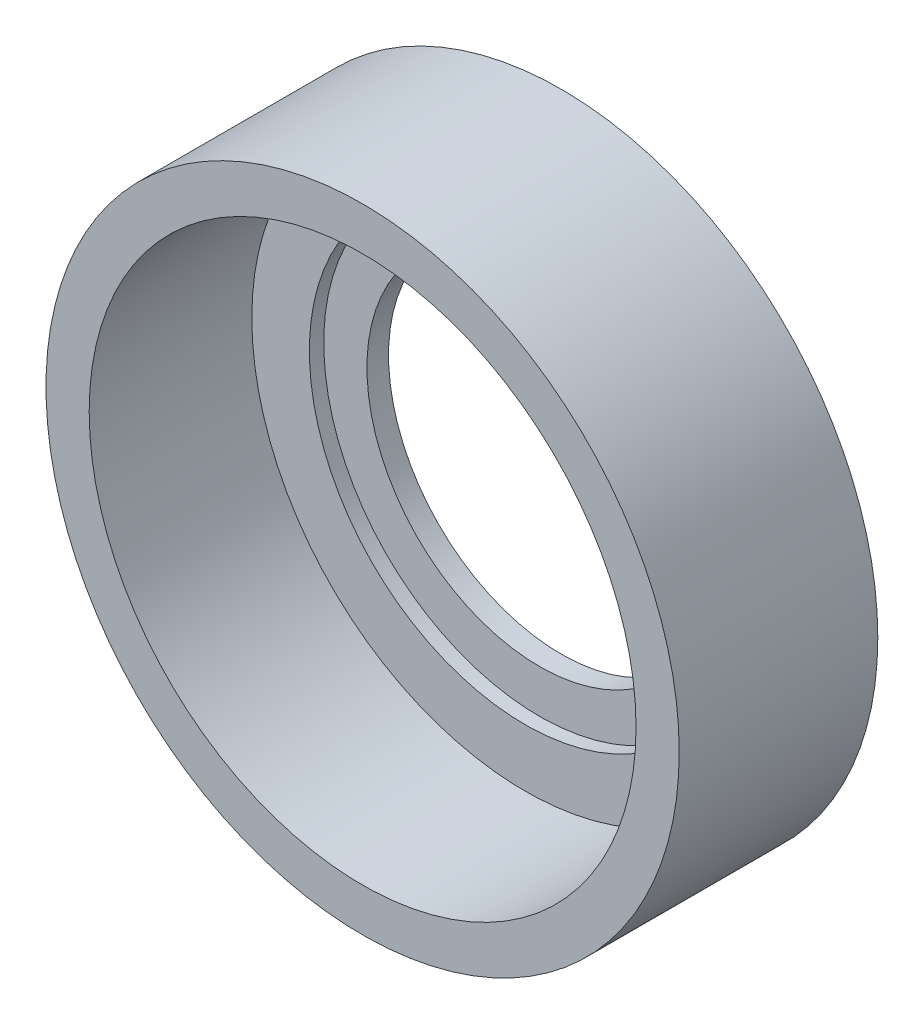
ISO-10303-21;
HEADER;
FILE_DESCRIPTION(('STEP AP214'),'2;1');
FILE_NAME('part.step','',(''),(''),'','','');
FILE_SCHEMA(('AUTOMOTIVE_DESIGN { 1 0 10303 214 1 1 1 1 }'));
ENDSEC;
DATA;
#1=APPLICATION_CONTEXT('core data for automotive mechanical design processes');
#2=APPLICATION_PROTOCOL_DEFINITION('international standard','automotive_design',2000,#1);
#3=PRODUCT_CONTEXT('',#1,'mechanical');
#4=PRODUCT('Part','Part','',(#3));
#5=PRODUCT_RELATED_PRODUCT_CATEGORY('part','',(#4));
#6=PRODUCT_DEFINITION_FORMATION('','',#4);
#7=PRODUCT_DEFINITION_CONTEXT('part definition',#1,'design');
#8=PRODUCT_DEFINITION('design','',#6,#7);
#9=PRODUCT_DEFINITION_SHAPE('','',#8);
#10=(LENGTH_UNIT() NAMED_UNIT(*) SI_UNIT(.MILLI.,.METRE.));
#11=(NAMED_UNIT(*) PLANE_ANGLE_UNIT() SI_UNIT($,.RADIAN.));
#12=(NAMED_UNIT(*) SI_UNIT($,.STERADIAN.) SOLID_ANGLE_UNIT());
#13=UNCERTAINTY_MEASURE_WITH_UNIT(LENGTH_MEASURE(1.E-05),#10,'distance_accuracy_value','');
#14=(GEOMETRIC_REPRESENTATION_CONTEXT(3) GLOBAL_UNCERTAINTY_ASSIGNED_CONTEXT((#13)) GLOBAL_UNIT_ASSIGNED_CONTEXT((#10,
#11,#12)) REPRESENTATION_CONTEXT('',''));
#15=CARTESIAN_POINT('',(0.,0.,0.));
#16=DIRECTION('',(0.,0.,1.));
#17=DIRECTION('',(1.,0.,0.));
#18=AXIS2_PLACEMENT_3D('',#15,#16,#17);
#19=CARTESIAN_POINT('',(0.,0.,1.25));
#20=DIRECTION('',(0.,0.,1.));
#21=DIRECTION('',(1.,0.,0.));
#22=AXIS2_PLACEMENT_3D('',#19,#20,#21);
#23=PLANE('',#22);
#24=CARTESIAN_POINT('',(0.,0.,1.25));
#25=DIRECTION('',(0.,0.,1.));
#26=DIRECTION('',(1.,0.,0.));
#27=AXIS2_PLACEMENT_3D('',#24,#25,#26);
#28=CIRCLE('',#27,7.5);
#29=CARTESIAN_POINT('',(7.5,0.,1.25));
#30=VERTEX_POINT('',#29);
#31=EDGE_CURVE('E62',#30,#30,#28,.T.);
#32=ORIENTED_EDGE('',*,*,#31,.F.);
#33=EDGE_LOOP('',(#32));
#34=FACE_BOUND('',#33,.T.);
#35=CARTESIAN_POINT('',(0.,0.,1.25));
#36=DIRECTION('',(0.,0.,1.));
#37=DIRECTION('',(1.,0.,0.));
#38=AXIS2_PLACEMENT_3D('',#35,#36,#37);
#39=CIRCLE('',#38,9.5);
#40=CARTESIAN_POINT('',(9.5,0.,1.25));
#41=VERTEX_POINT('',#40);
#42=EDGE_CURVE('E76',#41,#41,#39,.T.);
#43=ORIENTED_EDGE('',*,*,#42,.T.);
#44=EDGE_LOOP('',(#43));
#45=FACE_BOUND('',#44,.T.);
#46=ADVANCED_FACE('F43',(#34,#45),#23,.T.);
#47=CARTESIAN_POINT('',(0.,0.,0.75));
#48=DIRECTION('',(0.,0.,1.));
#49=DIRECTION('',(1.,0.,0.));
#50=AXIS2_PLACEMENT_3D('',#47,#48,#49);
#51=PLANE('',#50);
#52=CARTESIAN_POINT('',(0.,0.,0.75));
#53=DIRECTION('',(0.,0.,1.));
#54=DIRECTION('',(1.,0.,0.));
#55=AXIS2_PLACEMENT_3D('',#52,#53,#54);
#56=CIRCLE('',#55,6.);
#57=CARTESIAN_POINT('',(6.,0.,0.75));
#58=VERTEX_POINT('',#57);
#59=EDGE_CURVE('E51',#58,#58,#56,.T.);
#60=ORIENTED_EDGE('',*,*,#59,.F.);
#61=EDGE_LOOP('',(#60));
#62=FACE_BOUND('',#61,.T.);
#63=CARTESIAN_POINT('',(0.,0.,0.75));
#64=DIRECTION('',(0.,0.,1.));
#65=DIRECTION('',(1.,0.,0.));
#66=AXIS2_PLACEMENT_3D('',#63,#64,#65);
#67=CIRCLE('',#66,7.5);
#68=CARTESIAN_POINT('',(7.5,0.,0.75));
#69=VERTEX_POINT('',#68);
#70=EDGE_CURVE('E64',#69,#69,#67,.T.);
#71=ORIENTED_EDGE('',*,*,#70,.T.);
#72=EDGE_LOOP('',(#71));
#73=FACE_BOUND('',#72,.T.);
#74=ADVANCED_FACE('F102',(#62,#73),#51,.T.);
#75=CARTESIAN_POINT('',(0.,0.,0.));
#76=DIRECTION('',(0.,0.,1.));
#77=DIRECTION('',(1.,0.,0.));
#78=AXIS2_PLACEMENT_3D('',#75,#76,#77);
#79=PLANE('',#78);
#80=CARTESIAN_POINT('',(0.,0.,0.));
#81=DIRECTION('',(0.,0.,1.));
#82=DIRECTION('',(1.,0.,0.));
#83=AXIS2_PLACEMENT_3D('',#80,#81,#82);
#84=CIRCLE('',#83,11.);
#85=CARTESIAN_POINT('',(11.,0.,0.));
#86=VERTEX_POINT('',#85);
#87=EDGE_CURVE('E10',#86,#86,#84,.T.);
#88=ORIENTED_EDGE('',*,*,#87,.F.);
#89=EDGE_LOOP('',(#88));
#90=FACE_BOUND('',#89,.T.);
#91=CARTESIAN_POINT('',(0.,0.,0.));
#92=DIRECTION('',(0.,0.,1.));
#93=DIRECTION('',(1.,0.,0.));
#94=AXIS2_PLACEMENT_3D('',#91,#92,#93);
#95=CIRCLE('',#94,6.);
#96=CARTESIAN_POINT('',(6.,0.,0.));
#97=VERTEX_POINT('',#96);
#98=EDGE_CURVE('E56',#97,#97,#95,.T.);
#99=ORIENTED_EDGE('',*,*,#98,.T.);
#100=EDGE_LOOP('',(#99));
#101=FACE_BOUND('',#100,.T.);
#102=ADVANCED_FACE('F108',(#90,#101),#79,.F.);
#103=CARTESIAN_POINT('',(0.,0.,0.75));
#104=DIRECTION('',(0.,0.,-1.));
#105=DIRECTION('',(-1.,0.,0.));
#106=AXIS2_PLACEMENT_3D('',#103,#104,#105);
#107=CYLINDRICAL_SURFACE('',#106,11.);
#108=ORIENTED_EDGE('',*,*,#87,.T.);
#109=EDGE_LOOP('',(#108));
#110=FACE_BOUND('',#109,.T.);
#111=CARTESIAN_POINT('',(0.,0.,6.9));
#112=DIRECTION('',(0.,0.,1.));
#113=DIRECTION('',(1.,0.,0.));
#114=AXIS2_PLACEMENT_3D('',#111,#112,#113);
#115=CIRCLE('',#114,11.);
#116=CARTESIAN_POINT('',(11.,0.,6.9));
#117=VERTEX_POINT('',#116);
#118=EDGE_CURVE('E68',#117,#117,#115,.T.);
#119=ORIENTED_EDGE('',*,*,#118,.F.);
#120=EDGE_LOOP('',(#119));
#121=FACE_BOUND('',#120,.T.);
#122=ADVANCED_FACE('F45',(#110,#121),#107,.T.);
#123=CARTESIAN_POINT('',(0.,0.,0.75));
#124=DIRECTION('',(0.,0.,-1.));
#125=DIRECTION('',(-1.,0.,0.));
#126=AXIS2_PLACEMENT_3D('',#123,#124,#125);
#127=CYLINDRICAL_SURFACE('',#126,6.);
#128=ORIENTED_EDGE('',*,*,#59,.T.);
#129=EDGE_LOOP('',(#128));
#130=FACE_BOUND('',#129,.T.);
#131=ORIENTED_EDGE('',*,*,#98,.F.);
#132=EDGE_LOOP('',(#131));
#133=FACE_BOUND('',#132,.T.);
#134=ADVANCED_FACE('F98',(#130,#133),#127,.F.);
#135=CARTESIAN_POINT('',(0.,0.,1.25));
#136=DIRECTION('',(0.,0.,-1.));
#137=DIRECTION('',(-1.,0.,0.));
#138=AXIS2_PLACEMENT_3D('',#135,#136,#137);
#139=CYLINDRICAL_SURFACE('',#138,7.5);
#140=ORIENTED_EDGE('',*,*,#31,.T.);
#141=EDGE_LOOP('',(#140));
#142=FACE_BOUND('',#141,.T.);
#143=ORIENTED_EDGE('',*,*,#70,.F.);
#144=EDGE_LOOP('',(#143));
#145=FACE_BOUND('',#144,.T.);
#146=ADVANCED_FACE('F89',(#142,#145),#139,.F.);
#147=CARTESIAN_POINT('',(0.,0.,6.9));
#148=DIRECTION('',(0.,0.,1.));
#149=DIRECTION('',(1.,0.,0.));
#150=AXIS2_PLACEMENT_3D('',#147,#148,#149);
#151=PLANE('',#150);
#152=ORIENTED_EDGE('',*,*,#118,.T.);
#153=EDGE_LOOP('',(#152));
#154=FACE_BOUND('',#153,.T.);
#155=CARTESIAN_POINT('',(0.,0.,6.9));
#156=DIRECTION('',(0.,0.,1.));
#157=DIRECTION('',(1.,0.,0.));
#158=AXIS2_PLACEMENT_3D('',#155,#156,#157);
#159=CIRCLE('',#158,9.5);
#160=CARTESIAN_POINT('',(9.5,0.,6.9));
#161=VERTEX_POINT('',#160);
#162=EDGE_CURVE('E75',#161,#161,#159,.T.);
#163=ORIENTED_EDGE('',*,*,#162,.F.);
#164=EDGE_LOOP('',(#163));
#165=FACE_BOUND('',#164,.T.);
#166=ADVANCED_FACE('F87',(#154,#165),#151,.T.);
#167=CARTESIAN_POINT('',(0.,0.,6.9));
#168=DIRECTION('',(0.,0.,-1.));
#169=DIRECTION('',(-1.,0.,0.));
#170=AXIS2_PLACEMENT_3D('',#167,#168,#169);
#171=CYLINDRICAL_SURFACE('',#170,9.5);
#172=ORIENTED_EDGE('',*,*,#162,.T.);
#173=EDGE_LOOP('',(#172));
#174=FACE_BOUND('',#173,.T.);
#175=ORIENTED_EDGE('',*,*,#42,.F.);
#176=EDGE_LOOP('',(#175));
#177=FACE_BOUND('',#176,.T.);
#178=ADVANCED_FACE('F84',(#174,#177),#171,.F.);
#179=CLOSED_SHELL('',(#46,#74,#102,#122,#134,#146,#166,#178));
#180=MANIFOLD_SOLID_BREP('B2',#179);
#181=ADVANCED_BREP_SHAPE_REPRESENTATION('',(#18,#180),#14);
#182=SHAPE_DEFINITION_REPRESENTATION(#9,#181);
ENDSEC;
END-ISO-10303-21;
